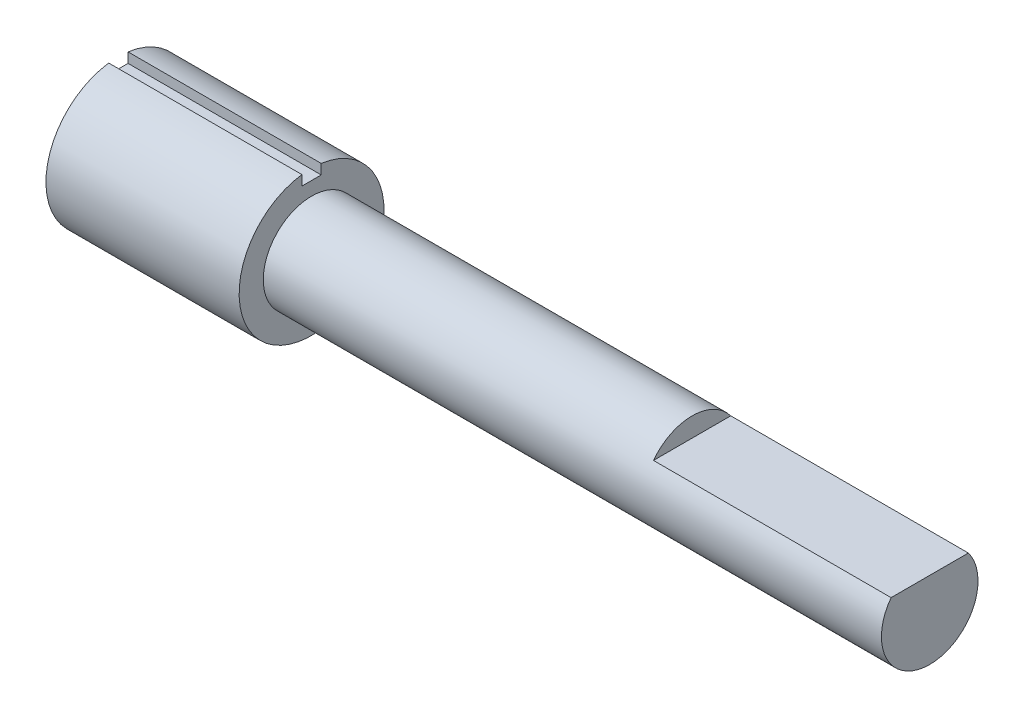
ISO-10303-21;
HEADER;
FILE_DESCRIPTION(('STEP AP214'),'2;1');
FILE_NAME('part.step','',(''),(''),'','','');
FILE_SCHEMA(('AUTOMOTIVE_DESIGN { 1 0 10303 214 1 1 1 1 }'));
ENDSEC;
DATA;
#1=APPLICATION_CONTEXT('core data for automotive mechanical design processes');
#2=APPLICATION_PROTOCOL_DEFINITION('international standard','automotive_design',2000,#1);
#3=PRODUCT_CONTEXT('',#1,'mechanical');
#4=PRODUCT('Part','Part','',(#3));
#5=PRODUCT_RELATED_PRODUCT_CATEGORY('part','',(#4));
#6=PRODUCT_DEFINITION_FORMATION('','',#4);
#7=PRODUCT_DEFINITION_CONTEXT('part definition',#1,'design');
#8=PRODUCT_DEFINITION('design','',#6,#7);
#9=PRODUCT_DEFINITION_SHAPE('','',#8);
#10=(LENGTH_UNIT() NAMED_UNIT(*) SI_UNIT(.MILLI.,.METRE.));
#11=(NAMED_UNIT(*) PLANE_ANGLE_UNIT() SI_UNIT($,.RADIAN.));
#12=(NAMED_UNIT(*) SI_UNIT($,.STERADIAN.) SOLID_ANGLE_UNIT());
#13=UNCERTAINTY_MEASURE_WITH_UNIT(LENGTH_MEASURE(1.E-05),#10,'distance_accuracy_value','');
#14=(GEOMETRIC_REPRESENTATION_CONTEXT(3) GLOBAL_UNCERTAINTY_ASSIGNED_CONTEXT((#13)) GLOBAL_UNIT_ASSIGNED_CONTEXT((#10,
#11,#12)) REPRESENTATION_CONTEXT('',''));
#15=CARTESIAN_POINT('',(0.,0.,0.));
#16=DIRECTION('',(0.,0.,1.));
#17=DIRECTION('',(1.,0.,0.));
#18=AXIS2_PLACEMENT_3D('',#15,#16,#17);
#19=CARTESIAN_POINT('',(12.7,0.,0.));
#20=DIRECTION('',(-1.,0.,0.));
#21=DIRECTION('',(0.,0.,1.));
#22=AXIS2_PLACEMENT_3D('',#19,#20,#21);
#23=CYLINDRICAL_SURFACE('',#22,4.7625);
#24=DIRECTION('',(-1.,0.,0.));
#25=VECTOR('',#24,1.);
#26=CARTESIAN_POINT('',(12.7,4.7200117590917,0.634740296527682));
#27=LINE('',#26,#25);
#28=CARTESIAN_POINT('',(0.,4.7200117590917,0.634740296527682));
#29=VERTEX_POINT('',#28);
#30=CARTESIAN_POINT('',(12.7,4.7200117590917,0.634740296527682));
#31=VERTEX_POINT('',#30);
#32=EDGE_CURVE('E140',#29,#31,#27,.F.);
#33=ORIENTED_EDGE('',*,*,#32,.F.);
#34=CARTESIAN_POINT('',(0.,0.,0.));
#35=DIRECTION('',(1.,0.,0.));
#36=DIRECTION('',(0.,0.,-1.));
#37=AXIS2_PLACEMENT_3D('',#34,#35,#36);
#38=CIRCLE('',#37,4.7625);
#39=CARTESIAN_POINT('',(0.,4.71997682727363,-0.635));
#40=VERTEX_POINT('',#39);
#41=EDGE_CURVE('E48',#29,#40,#38,.T.);
#42=ORIENTED_EDGE('',*,*,#41,.T.);
#43=DIRECTION('',(-1.,0.,0.));
#44=VECTOR('',#43,1.);
#45=CARTESIAN_POINT('',(12.7,4.71997682727363,-0.635));
#46=LINE('',#45,#44);
#47=CARTESIAN_POINT('',(12.7,4.71997682727363,-0.635));
#48=VERTEX_POINT('',#47);
#49=EDGE_CURVE('E62',#40,#48,#46,.F.);
#50=ORIENTED_EDGE('',*,*,#49,.T.);
#51=CARTESIAN_POINT('',(12.7,0.,0.));
#52=DIRECTION('',(1.,0.,0.));
#53=DIRECTION('',(0.,0.,-1.));
#54=AXIS2_PLACEMENT_3D('',#51,#52,#53);
#55=CIRCLE('',#54,4.7625);
#56=EDGE_CURVE('E54',#31,#48,#55,.T.);
#57=ORIENTED_EDGE('',*,*,#56,.F.);
#58=EDGE_LOOP('',(#33,#42,#50,#57));
#59=FACE_BOUND('',#58,.T.);
#60=ADVANCED_FACE('F45',(#59),#23,.T.);
#61=CARTESIAN_POINT('',(12.7,0.,0.));
#62=DIRECTION('',(1.,0.,0.));
#63=DIRECTION('',(0.,0.,-1.));
#64=AXIS2_PLACEMENT_3D('',#61,#62,#63);
#65=PLANE('',#64);
#66=CARTESIAN_POINT('',(12.7,0.,0.));
#67=DIRECTION('',(1.,0.,0.));
#68=DIRECTION('',(0.,0.,-1.));
#69=AXIS2_PLACEMENT_3D('',#66,#67,#68);
#70=CIRCLE('',#69,3.175);
#71=CARTESIAN_POINT('',(12.7,0.,-3.175));
#72=VERTEX_POINT('',#71);
#73=EDGE_CURVE('E11',#72,#72,#70,.T.);
#74=ORIENTED_EDGE('',*,*,#73,.F.);
#75=EDGE_LOOP('',(#74));
#76=FACE_BOUND('',#75,.T.);
#77=DIRECTION('',(0.,0.,-1.));
#78=VECTOR('',#77,1.);
#79=CARTESIAN_POINT('',(12.7,4.06400007715956,0.634740296527682));
#80=LINE('',#79,#78);
#81=CARTESIAN_POINT('',(12.7,4.06400007715956,0.634740296527682));
#82=VERTEX_POINT('',#81);
#83=CARTESIAN_POINT('',(12.7,4.06400007715956,-0.635));
#84=VERTEX_POINT('',#83);
#85=EDGE_CURVE('E108',#82,#84,#80,.T.);
#86=ORIENTED_EDGE('',*,*,#85,.F.);
#87=DIRECTION('',(0.,1.,0.));
#88=VECTOR('',#87,1.);
#89=CARTESIAN_POINT('',(12.7,4.06400007715956,0.634740296527682));
#90=LINE('',#89,#88);
#91=EDGE_CURVE('E123',#82,#31,#90,.T.);
#92=ORIENTED_EDGE('',*,*,#91,.T.);
#93=ORIENTED_EDGE('',*,*,#56,.T.);
#94=DIRECTION('',(0.,1.,0.));
#95=VECTOR('',#94,1.);
#96=CARTESIAN_POINT('',(12.7,4.06400007715956,-0.635));
#97=LINE('',#96,#95);
#98=EDGE_CURVE('E127',#84,#48,#97,.T.);
#99=ORIENTED_EDGE('',*,*,#98,.F.);
#100=EDGE_LOOP('',(#86,#92,#93,#99));
#101=FACE_BOUND('',#100,.T.);
#102=ADVANCED_FACE('F180',(#76,#101),#65,.T.);
#103=CARTESIAN_POINT('',(0.,0.,0.));
#104=DIRECTION('',(1.,0.,0.));
#105=DIRECTION('',(0.,0.,-1.));
#106=AXIS2_PLACEMENT_3D('',#103,#104,#105);
#107=PLANE('',#106);
#108=CARTESIAN_POINT('',(0.,0.,0.));
#109=DIRECTION('',(-1.,0.,0.));
#110=DIRECTION('',(0.,0.,1.));
#111=AXIS2_PLACEMENT_3D('',#108,#109,#110);
#112=CIRCLE('',#111,2.54);
#113=CARTESIAN_POINT('',(0.,0.,2.54));
#114=VERTEX_POINT('',#113);
#115=EDGE_CURVE('E162',#114,#114,#112,.T.);
#116=ORIENTED_EDGE('',*,*,#115,.F.);
#117=EDGE_LOOP('',(#116));
#118=FACE_BOUND('',#117,.T.);
#119=DIRECTION('',(0.,1.,0.));
#120=VECTOR('',#119,1.);
#121=CARTESIAN_POINT('',(0.,4.06400007715956,0.634740296527682));
#122=LINE('',#121,#120);
#123=CARTESIAN_POINT('',(0.,4.06400007715956,0.634740296527682));
#124=VERTEX_POINT('',#123);
#125=EDGE_CURVE('E112',#124,#29,#122,.T.);
#126=ORIENTED_EDGE('',*,*,#125,.F.);
#127=DIRECTION('',(0.,0.,-1.));
#128=VECTOR('',#127,1.);
#129=CARTESIAN_POINT('',(0.,4.06400007715956,0.634740296527682));
#130=LINE('',#129,#128);
#131=CARTESIAN_POINT('',(0.,4.06400007715956,-0.635));
#132=VERTEX_POINT('',#131);
#133=EDGE_CURVE('E105',#124,#132,#130,.T.);
#134=ORIENTED_EDGE('',*,*,#133,.T.);
#135=DIRECTION('',(0.,1.,0.));
#136=VECTOR('',#135,1.);
#137=CARTESIAN_POINT('',(0.,4.06400007715956,-0.635));
#138=LINE('',#137,#136);
#139=EDGE_CURVE('E114',#132,#40,#138,.T.);
#140=ORIENTED_EDGE('',*,*,#139,.T.);
#141=ORIENTED_EDGE('',*,*,#41,.F.);
#142=EDGE_LOOP('',(#126,#134,#140,#141));
#143=FACE_BOUND('',#142,.T.);
#144=ADVANCED_FACE('F121',(#118,#143),#107,.F.);
#145=CARTESIAN_POINT('',(9.525,0.,0.));
#146=DIRECTION('',(-1.,0.,0.));
#147=DIRECTION('',(0.,0.,1.));
#148=AXIS2_PLACEMENT_3D('',#145,#146,#147);
#149=CYLINDRICAL_SURFACE('',#148,2.54);
#150=CARTESIAN_POINT('',(9.525,0.,0.));
#151=DIRECTION('',(-1.,0.,0.));
#152=DIRECTION('',(0.,0.,1.));
#153=AXIS2_PLACEMENT_3D('',#150,#151,#152);
#154=CIRCLE('',#153,2.54);
#155=CARTESIAN_POINT('',(9.525,0.,2.54));
#156=VERTEX_POINT('',#155);
#157=EDGE_CURVE('E164',#156,#156,#154,.T.);
#158=CARTESIAN_POINT('',(9.525,0.,2.54));
#159=CARTESIAN_POINT('',(9.42578125,0.,2.54));
#160=CARTESIAN_POINT('',(9.3265625,0.,2.54));
#161=CARTESIAN_POINT('',(9.128125,0.,2.54));
#162=CARTESIAN_POINT('',(9.02890625,0.,2.54));
#163=CARTESIAN_POINT('',(8.83046875,0.,2.54));
#164=CARTESIAN_POINT('',(8.73125,0.,2.54));
#165=CARTESIAN_POINT('',(8.5328125,0.,2.54));
#166=CARTESIAN_POINT('',(8.43359375,0.,2.54));
#167=CARTESIAN_POINT('',(8.23515625,0.,2.54));
#168=CARTESIAN_POINT('',(8.1359375,0.,2.54));
#169=CARTESIAN_POINT('',(7.9375,0.,2.54));
#170=CARTESIAN_POINT('',(7.83828125,0.,2.54));
#171=CARTESIAN_POINT('',(7.63984375,0.,2.54));
#172=CARTESIAN_POINT('',(7.540625,0.,2.54));
#173=CARTESIAN_POINT('',(7.3421875,0.,2.54));
#174=CARTESIAN_POINT('',(7.24296875,0.,2.54));
#175=CARTESIAN_POINT('',(7.04453125,0.,2.54));
#176=CARTESIAN_POINT('',(6.9453125,0.,2.54));
#177=CARTESIAN_POINT('',(6.746875,0.,2.54));
#178=CARTESIAN_POINT('',(6.64765625,0.,2.54));
#179=CARTESIAN_POINT('',(6.44921875,0.,2.54));
#180=CARTESIAN_POINT('',(6.35,0.,2.54));
#181=CARTESIAN_POINT('',(6.1515625,0.,2.54));
#182=CARTESIAN_POINT('',(6.05234375,0.,2.54));
#183=CARTESIAN_POINT('',(5.85390625,0.,2.54));
#184=CARTESIAN_POINT('',(5.7546875,0.,2.54));
#185=CARTESIAN_POINT('',(5.55625,0.,2.54));
#186=CARTESIAN_POINT('',(5.45703125,0.,2.54));
#187=CARTESIAN_POINT('',(5.25859375,0.,2.54));
#188=CARTESIAN_POINT('',(5.159375,0.,2.54));
#189=CARTESIAN_POINT('',(4.9609375,0.,2.54));
#190=CARTESIAN_POINT('',(4.86171875,0.,2.54));
#191=CARTESIAN_POINT('',(4.66328125,0.,2.54));
#192=CARTESIAN_POINT('',(4.5640625,0.,2.54));
#193=CARTESIAN_POINT('',(4.365625,0.,2.54));
#194=CARTESIAN_POINT('',(4.26640625,0.,2.54));
#195=CARTESIAN_POINT('',(4.06796875,0.,2.54));
#196=CARTESIAN_POINT('',(3.96875,0.,2.54));
#197=CARTESIAN_POINT('',(3.7703125,0.,2.54));
#198=CARTESIAN_POINT('',(3.67109375,0.,2.54));
#199=CARTESIAN_POINT('',(3.47265625,0.,2.54));
#200=CARTESIAN_POINT('',(3.3734375,0.,2.54));
#201=CARTESIAN_POINT('',(3.175,0.,2.54));
#202=CARTESIAN_POINT('',(3.07578125,0.,2.54));
#203=CARTESIAN_POINT('',(2.87734375,0.,2.54));
#204=CARTESIAN_POINT('',(2.778125,0.,2.54));
#205=CARTESIAN_POINT('',(2.5796875,0.,2.54));
#206=CARTESIAN_POINT('',(2.48046875,0.,2.54));
#207=CARTESIAN_POINT('',(2.28203125,0.,2.54));
#208=CARTESIAN_POINT('',(2.1828125,0.,2.54));
#209=CARTESIAN_POINT('',(1.984375,0.,2.54));
#210=CARTESIAN_POINT('',(1.88515625,0.,2.54));
#211=CARTESIAN_POINT('',(1.68671875,0.,2.54));
#212=CARTESIAN_POINT('',(1.5875,0.,2.54));
#213=CARTESIAN_POINT('',(1.3890625,0.,2.54));
#214=CARTESIAN_POINT('',(1.28984375,0.,2.54));
#215=CARTESIAN_POINT('',(1.09140625,0.,2.54));
#216=CARTESIAN_POINT('',(0.992187500000001,0.,2.54));
#217=CARTESIAN_POINT('',(0.793750000000001,0.,2.54));
#218=CARTESIAN_POINT('',(0.69453125,0.,2.54));
#219=CARTESIAN_POINT('',(0.49609375,0.,2.54));
#220=CARTESIAN_POINT('',(0.396875,0.,2.54));
#221=CARTESIAN_POINT('',(0.1984375,0.,2.54));
#222=CARTESIAN_POINT('',(0.0992187500000001,0.,2.54));
#223=CARTESIAN_POINT('',(0.,0.,2.54));
#224=B_SPLINE_CURVE_WITH_KNOTS('',3,(#158,#159,#160,#161,#162,#163,#164,#165,#166,#167,#168,
#169,#170,#171,#172,#173,#174,#175,#176,#177,#178,#179,#180,#181,#182,#183,#184,#185,#186,#187,
#188,#189,#190,#191,#192,#193,#194,#195,#196,#197,#198,#199,#200,#201,#202,#203,#204,#205,#206,
#207,#208,#209,#210,#211,#212,#213,#214,#215,#216,#217,#218,#219,#220,#221,#222,#223),
.UNSPECIFIED.,.F.,.F.,(4,2,2,2,2,2,2,2,2,2,2,2,2,2,2,2,2,2,2,2,2,2,2,2,2,2,2,2,2,2,2,2,4),(0.,
0.29765625,0.5953125,0.892968750000001,1.190625,1.48828125,1.7859375,2.08359375,2.38125,
2.67890625,2.9765625,3.27421875,3.571875,3.86953125,4.1671875,4.46484375,4.7625,5.06015625,
5.3578125,5.65546875,5.953125,6.25078125,6.5484375,6.84609375,7.14375,7.44140625,7.7390625,
8.03671875,8.334375,8.63203125,8.9296875,9.22734375,9.525),.UNSPECIFIED.);
#225=EDGE_CURVE('BSEAM188',#156,#114,#224,.T.);
#226=ORIENTED_EDGE('',*,*,#157,.F.);
#227=ORIENTED_EDGE('',*,*,#115,.T.);
#228=ORIENTED_EDGE('',*,*,#225,.T.);
#229=ORIENTED_EDGE('',*,*,#225,.F.);
#230=EDGE_LOOP('',(#226,#228,#227,#229));
#231=FACE_BOUND('',#230,.T.);
#232=ADVANCED_FACE('F188',(#231),#149,.F.);
#233=CARTESIAN_POINT('',(9.525,0.,0.));
#234=DIRECTION('',(-1.,0.,0.));
#235=DIRECTION('',(0.,0.,1.));
#236=AXIS2_PLACEMENT_3D('',#233,#234,#235);
#237=PLANE('',#236);
#238=ORIENTED_EDGE('',*,*,#157,.T.);
#239=EDGE_LOOP('',(#238));
#240=FACE_BOUND('',#239,.T.);
#241=ADVANCED_FACE('F194',(#240),#237,.T.);
#242=CARTESIAN_POINT('',(53.34,0.,0.));
#243=DIRECTION('',(-1.,0.,0.));
#244=DIRECTION('',(0.,0.,1.));
#245=AXIS2_PLACEMENT_3D('',#242,#243,#244);
#246=CYLINDRICAL_SURFACE('',#245,3.175);
#247=CARTESIAN_POINT('',(53.34,0.,0.));
#248=DIRECTION('',(1.,0.,0.));
#249=DIRECTION('',(0.,0.,-1.));
#250=AXIS2_PLACEMENT_3D('',#247,#248,#249);
#251=CIRCLE('',#250,3.175);
#252=CARTESIAN_POINT('',(53.34,1.905,2.54));
#253=VERTEX_POINT('',#252);
#254=CARTESIAN_POINT('',(53.34,1.905,-2.54));
#255=VERTEX_POINT('',#254);
#256=EDGE_CURVE('E157',#253,#255,#251,.T.);
#257=ORIENTED_EDGE('',*,*,#256,.F.);
#258=DIRECTION('',(1.,0.,0.));
#259=VECTOR('',#258,1.);
#260=CARTESIAN_POINT('',(37.719,1.905,2.54));
#261=LINE('',#260,#259);
#262=CARTESIAN_POINT('',(37.719,1.905,2.54));
#263=VERTEX_POINT('',#262);
#264=EDGE_CURVE('E70',#263,#253,#261,.T.);
#265=ORIENTED_EDGE('',*,*,#264,.F.);
#266=CARTESIAN_POINT('',(37.719,0.,0.));
#267=DIRECTION('',(1.,0.,0.));
#268=DIRECTION('',(0.,0.,1.));
#269=AXIS2_PLACEMENT_3D('',#266,#267,#268);
#270=CIRCLE('',#269,3.175);
#271=CARTESIAN_POINT('',(37.719,1.905,-2.54));
#272=VERTEX_POINT('',#271);
#273=EDGE_CURVE('E144',#272,#263,#270,.T.);
#274=ORIENTED_EDGE('',*,*,#273,.F.);
#275=DIRECTION('',(1.,0.,0.));
#276=VECTOR('',#275,1.);
#277=CARTESIAN_POINT('',(37.719,1.905,-2.54));
#278=LINE('',#277,#276);
#279=EDGE_CURVE('E153',#272,#255,#278,.T.);
#280=ORIENTED_EDGE('',*,*,#279,.T.);
#281=EDGE_LOOP('',(#257,#265,#274,#280));
#282=FACE_BOUND('',#281,.T.);
#283=ORIENTED_EDGE('',*,*,#73,.T.);
#284=EDGE_LOOP('',(#283));
#285=FACE_BOUND('',#284,.T.);
#286=ADVANCED_FACE('F198',(#282,#285),#246,.T.);
#287=CARTESIAN_POINT('',(53.34,0.,0.));
#288=DIRECTION('',(1.,0.,0.));
#289=DIRECTION('',(0.,0.,-1.));
#290=AXIS2_PLACEMENT_3D('',#287,#288,#289);
#291=PLANE('',#290);
#292=DIRECTION('',(0.,0.,-1.));
#293=VECTOR('',#292,1.);
#294=CARTESIAN_POINT('',(53.34,1.905,2.54));
#295=LINE('',#294,#293);
#296=EDGE_CURVE('E143',#253,#255,#295,.T.);
#297=ORIENTED_EDGE('',*,*,#296,.F.);
#298=ORIENTED_EDGE('',*,*,#256,.T.);
#299=EDGE_LOOP('',(#297,#298));
#300=FACE_BOUND('',#299,.T.);
#301=ADVANCED_FACE('F202',(#300),#291,.T.);
#302=CARTESIAN_POINT('',(37.719,1.905,2.54));
#303=DIRECTION('',(0.,-1.,0.));
#304=DIRECTION('',(0.,0.,-1.));
#305=AXIS2_PLACEMENT_3D('',#302,#303,#304);
#306=PLANE('',#305);
#307=ORIENTED_EDGE('',*,*,#296,.T.);
#308=ORIENTED_EDGE('',*,*,#279,.F.);
#309=DIRECTION('',(0.,0.,-1.));
#310=VECTOR('',#309,1.);
#311=CARTESIAN_POINT('',(37.719,1.905,2.54));
#312=LINE('',#311,#310);
#313=EDGE_CURVE('E147',#263,#272,#312,.T.);
#314=ORIENTED_EDGE('',*,*,#313,.F.);
#315=ORIENTED_EDGE('',*,*,#264,.T.);
#316=EDGE_LOOP('',(#307,#308,#314,#315));
#317=FACE_BOUND('',#316,.T.);
#318=ADVANCED_FACE('F206',(#317),#306,.F.);
#319=CARTESIAN_POINT('',(37.719,0.,0.));
#320=DIRECTION('',(-1.,0.,0.));
#321=DIRECTION('',(0.,0.,1.));
#322=AXIS2_PLACEMENT_3D('',#319,#320,#321);
#323=PLANE('',#322);
#324=ORIENTED_EDGE('',*,*,#273,.T.);
#325=ORIENTED_EDGE('',*,*,#313,.T.);
#326=EDGE_LOOP('',(#324,#325));
#327=FACE_BOUND('',#326,.T.);
#328=ADVANCED_FACE('F210',(#327),#323,.F.);
#329=CARTESIAN_POINT('',(0.,4.06400007715956,0.634740296527682));
#330=DIRECTION('',(0.,0.,-1.));
#331=DIRECTION('',(-1.,0.,0.));
#332=AXIS2_PLACEMENT_3D('',#329,#330,#331);
#333=PLANE('',#332);
#334=ORIENTED_EDGE('',*,*,#32,.T.);
#335=ORIENTED_EDGE('',*,*,#91,.F.);
#336=DIRECTION('',(1.,0.,0.));
#337=VECTOR('',#336,1.);
#338=CARTESIAN_POINT('',(0.,4.06400007715956,0.634740296527682));
#339=LINE('',#338,#337);
#340=EDGE_CURVE('E111',#124,#82,#339,.T.);
#341=ORIENTED_EDGE('',*,*,#340,.F.);
#342=ORIENTED_EDGE('',*,*,#125,.T.);
#343=EDGE_LOOP('',(#334,#335,#341,#342));
#344=FACE_BOUND('',#343,.T.);
#345=ADVANCED_FACE('F179',(#344),#333,.T.);
#346=CARTESIAN_POINT('',(0.,4.06400007715956,-0.635));
#347=DIRECTION('',(0.,0.,-1.));
#348=DIRECTION('',(-1.,0.,0.));
#349=AXIS2_PLACEMENT_3D('',#346,#347,#348);
#350=PLANE('',#349);
#351=ORIENTED_EDGE('',*,*,#139,.F.);
#352=DIRECTION('',(1.,0.,0.));
#353=VECTOR('',#352,1.);
#354=CARTESIAN_POINT('',(0.,4.06400007715956,-0.635));
#355=LINE('',#354,#353);
#356=EDGE_CURVE('E102',#132,#84,#355,.T.);
#357=ORIENTED_EDGE('',*,*,#356,.T.);
#358=ORIENTED_EDGE('',*,*,#98,.T.);
#359=ORIENTED_EDGE('',*,*,#49,.F.);
#360=EDGE_LOOP('',(#351,#357,#358,#359));
#361=FACE_BOUND('',#360,.T.);
#362=ADVANCED_FACE('F115',(#361),#350,.F.);
#363=CARTESIAN_POINT('',(0.,4.06400007715956,0.634740296527682));
#364=DIRECTION('',(0.,-1.,0.));
#365=DIRECTION('',(0.,0.,-1.));
#366=AXIS2_PLACEMENT_3D('',#363,#364,#365);
#367=PLANE('',#366);
#368=ORIENTED_EDGE('',*,*,#85,.T.);
#369=ORIENTED_EDGE('',*,*,#356,.F.);
#370=ORIENTED_EDGE('',*,*,#133,.F.);
#371=ORIENTED_EDGE('',*,*,#340,.T.);
#372=EDGE_LOOP('',(#368,#369,#370,#371));
#373=FACE_BOUND('',#372,.T.);
#374=ADVANCED_FACE('F103',(#373),#367,.F.);
#375=CLOSED_SHELL('',(#60,#102,#144,#232,#241,#286,#301,#318,#328,#345,#362,#374));
#376=MANIFOLD_SOLID_BREP('B2',#375);
#377=ADVANCED_BREP_SHAPE_REPRESENTATION('',(#18,#376),#14);
#378=SHAPE_DEFINITION_REPRESENTATION(#9,#377);
ENDSEC;
END-ISO-10303-21;
